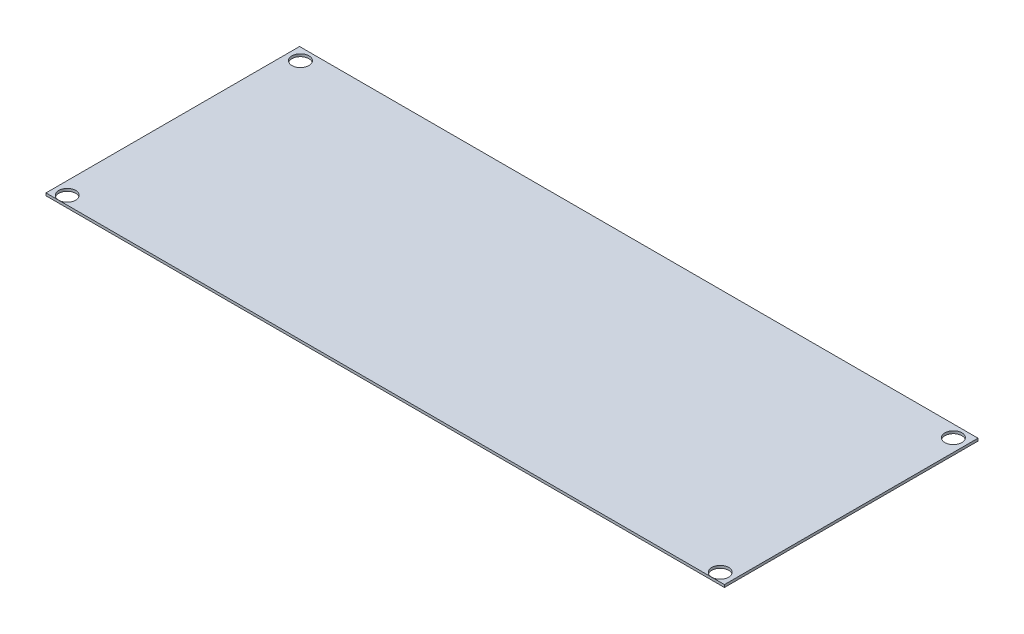
ISO-10303-21;
HEADER;
FILE_DESCRIPTION(('STEP AP214'),'2;1');
FILE_NAME('part.step','',(''),(''),'','','');
FILE_SCHEMA(('AUTOMOTIVE_DESIGN { 1 0 10303 214 1 1 1 1 }'));
ENDSEC;
DATA;
#1=APPLICATION_CONTEXT('core data for automotive mechanical design processes');
#2=APPLICATION_PROTOCOL_DEFINITION('international standard','automotive_design',2000,#1);
#3=PRODUCT_CONTEXT('',#1,'mechanical');
#4=PRODUCT('Part','Part','',(#3));
#5=PRODUCT_RELATED_PRODUCT_CATEGORY('part','',(#4));
#6=PRODUCT_DEFINITION_FORMATION('','',#4);
#7=PRODUCT_DEFINITION_CONTEXT('part definition',#1,'design');
#8=PRODUCT_DEFINITION('design','',#6,#7);
#9=PRODUCT_DEFINITION_SHAPE('','',#8);
#10=(LENGTH_UNIT() NAMED_UNIT(*) SI_UNIT(.MILLI.,.METRE.));
#11=(NAMED_UNIT(*) PLANE_ANGLE_UNIT() SI_UNIT($,.RADIAN.));
#12=(NAMED_UNIT(*) SI_UNIT($,.STERADIAN.) SOLID_ANGLE_UNIT());
#13=UNCERTAINTY_MEASURE_WITH_UNIT(LENGTH_MEASURE(1.E-05),#10,'distance_accuracy_value','');
#14=(GEOMETRIC_REPRESENTATION_CONTEXT(3) GLOBAL_UNCERTAINTY_ASSIGNED_CONTEXT((#13)) GLOBAL_UNIT_ASSIGNED_CONTEXT((#10,
#11,#12)) REPRESENTATION_CONTEXT('',''));
#15=CARTESIAN_POINT('',(0.,0.,0.));
#16=DIRECTION('',(0.,0.,1.));
#17=DIRECTION('',(1.,0.,0.));
#18=AXIS2_PLACEMENT_3D('',#15,#16,#17);
#19=CARTESIAN_POINT('',(4.44089209850063E-13,1.24359290226694E-10,0.));
#20=DIRECTION('',(0.,0.,-1.));
#21=DIRECTION('',(1.,6.22399701222243E-13,0.));
#22=AXIS2_PLACEMENT_3D('',#19,#20,#21);
#23=PLANE('',#22);
#24=DIRECTION('',(-1.,-6.22399701222243E-13,0.));
#25=VECTOR('',#24,1.);
#26=CARTESIAN_POINT('',(-1.4432899320127E-12,3.00000000012436,0.));
#27=LINE('',#26,#25);
#28=CARTESIAN_POINT('',(400.,3.,0.));
#29=VERTEX_POINT('',#28);
#30=CARTESIAN_POINT('',(-400.000000000001,2.9999999998754,0.));
#31=VERTEX_POINT('',#30);
#32=EDGE_CURVE('E83',#29,#31,#27,.T.);
#33=ORIENTED_EDGE('',*,*,#32,.T.);
#34=DIRECTION('',(-6.22399701222243E-13,1.,0.));
#35=VECTOR('',#34,1.);
#36=CARTESIAN_POINT('',(-399.999999999999,-1.24600416789855E-10,0.));
#37=LINE('',#36,#35);
#38=CARTESIAN_POINT('',(-399.999999999999,-1.24600416789855E-10,0.));
#39=VERTEX_POINT('',#38);
#40=EDGE_CURVE('E12',#39,#31,#37,.T.);
#41=ORIENTED_EDGE('',*,*,#40,.F.);
#42=DIRECTION('',(-1.,-6.22399701222243E-13,0.));
#43=VECTOR('',#42,1.);
#44=CARTESIAN_POINT('',(4.44089209850063E-13,1.24359290226694E-10,0.));
#45=LINE('',#44,#43);
#46=CARTESIAN_POINT('',(400.,0.,0.));
#47=VERTEX_POINT('',#46);
#48=EDGE_CURVE('E79',#47,#39,#45,.T.);
#49=ORIENTED_EDGE('',*,*,#48,.F.);
#50=DIRECTION('',(0.,-1.,0.));
#51=VECTOR('',#50,1.);
#52=CARTESIAN_POINT('',(400.,3.,0.));
#53=LINE('',#52,#51);
#54=EDGE_CURVE('E105',#29,#47,#53,.T.);
#55=ORIENTED_EDGE('',*,*,#54,.F.);
#56=EDGE_LOOP('',(#33,#41,#49,#55));
#57=FACE_BOUND('',#56,.T.);
#58=ADVANCED_FACE('F40',(#57),#23,.F.);
#59=CARTESIAN_POINT('',(-399.999999999999,-1.24600416789855E-10,-300.));
#60=DIRECTION('',(1.,6.22399701222243E-13,0.));
#61=DIRECTION('',(0.,0.,1.));
#62=AXIS2_PLACEMENT_3D('',#59,#60,#61);
#63=PLANE('',#62);
#64=DIRECTION('',(0.,0.,-1.));
#65=VECTOR('',#64,1.);
#66=CARTESIAN_POINT('',(-400.000000000001,2.9999999998754,-300.));
#67=LINE('',#66,#65);
#68=CARTESIAN_POINT('',(-400.000000000001,2.9999999998754,-299.));
#69=VERTEX_POINT('',#68);
#70=EDGE_CURVE('E95',#31,#69,#67,.T.);
#71=ORIENTED_EDGE('',*,*,#70,.T.);
#72=DIRECTION('',(-6.22399701222243E-13,1.,0.));
#73=VECTOR('',#72,1.);
#74=CARTESIAN_POINT('',(-399.999999999999,-1.24600416789855E-10,-299.));
#75=LINE('',#74,#73);
#76=CARTESIAN_POINT('',(-399.999999999999,-1.24600416789855E-10,-299.));
#77=VERTEX_POINT('',#76);
#78=EDGE_CURVE('E50',#77,#69,#75,.T.);
#79=ORIENTED_EDGE('',*,*,#78,.F.);
#80=DIRECTION('',(0.,0.,-1.));
#81=VECTOR('',#80,1.);
#82=CARTESIAN_POINT('',(-399.999999999999,-1.24600416789855E-10,-300.));
#83=LINE('',#82,#81);
#84=EDGE_CURVE('E59',#39,#77,#83,.T.);
#85=ORIENTED_EDGE('',*,*,#84,.F.);
#86=ORIENTED_EDGE('',*,*,#40,.T.);
#87=EDGE_LOOP('',(#71,#79,#85,#86));
#88=FACE_BOUND('',#87,.T.);
#89=ADVANCED_FACE('F150',(#88),#63,.F.);
#90=CARTESIAN_POINT('',(4.9960036108132E-13,1.24359290226694E-10,-299.));
#91=DIRECTION('',(0.,0.,1.));
#92=DIRECTION('',(-1.,-6.22399701222243E-13,0.));
#93=AXIS2_PLACEMENT_3D('',#90,#91,#92);
#94=PLANE('',#93);
#95=DIRECTION('',(1.,6.22399701222243E-13,0.));
#96=VECTOR('',#95,1.);
#97=CARTESIAN_POINT('',(-1.38777878078145E-12,3.00000000012436,-299.));
#98=LINE('',#97,#96);
#99=CARTESIAN_POINT('',(400.,3.,-299.));
#100=VERTEX_POINT('',#99);
#101=EDGE_CURVE('E90',#69,#100,#98,.T.);
#102=ORIENTED_EDGE('',*,*,#101,.T.);
#103=DIRECTION('',(0.,-1.,0.));
#104=VECTOR('',#103,1.);
#105=CARTESIAN_POINT('',(400.,3.,-299.));
#106=LINE('',#105,#104);
#107=CARTESIAN_POINT('',(400.,0.,-299.));
#108=VERTEX_POINT('',#107);
#109=EDGE_CURVE('E44',#100,#108,#106,.T.);
#110=ORIENTED_EDGE('',*,*,#109,.T.);
#111=DIRECTION('',(1.,6.22399701222243E-13,0.));
#112=VECTOR('',#111,1.);
#113=CARTESIAN_POINT('',(4.9960036108132E-13,1.24359290226694E-10,-299.));
#114=LINE('',#113,#112);
#115=EDGE_CURVE('E70',#77,#108,#114,.T.);
#116=ORIENTED_EDGE('',*,*,#115,.F.);
#117=ORIENTED_EDGE('',*,*,#78,.T.);
#118=EDGE_LOOP('',(#102,#110,#116,#117));
#119=FACE_BOUND('',#118,.T.);
#120=ADVANCED_FACE('F42',(#119),#94,.F.);
#121=CARTESIAN_POINT('',(4.9960036108132E-13,1.24359290226694E-10,0.));
#122=DIRECTION('',(6.22399701222243E-13,-1.,0.));
#123=DIRECTION('',(0.,0.,1.));
#124=AXIS2_PLACEMENT_3D('',#121,#122,#123);
#125=PLANE('',#124);
#126=CARTESIAN_POINT('',(-384.999999999999,-1.15264568723017E-10,-10.0499999999999));
#127=DIRECTION('',(6.22399701222243E-13,-1.,0.));
#128=DIRECTION('',(0.,0.,1.));
#129=AXIS2_PLACEMENT_3D('',#126,#127,#128);
#130=CIRCLE('',#129,9.99999999999998);
#131=CARTESIAN_POINT('',(-384.999999999999,-1.15265436084755E-10,-0.0499999999999112));
#132=VERTEX_POINT('',#131);
#133=EDGE_CURVE('E109',#132,#132,#130,.T.);
#134=ORIENTED_EDGE('',*,*,#133,.F.);
#135=EDGE_LOOP('',(#134));
#136=FACE_BOUND('',#135,.T.);
#137=CARTESIAN_POINT('',(-384.999999999999,-1.15264568723017E-10,-285.));
#138=DIRECTION('',(6.22399701222243E-13,-1.,0.));
#139=DIRECTION('',(0.,0.,1.));
#140=AXIS2_PLACEMENT_3D('',#137,#138,#139);
#141=CIRCLE('',#140,9.99999999999998);
#142=CARTESIAN_POINT('',(-384.999999999999,-1.15265436084755E-10,-275.));
#143=VERTEX_POINT('',#142);
#144=EDGE_CURVE('E106',#143,#143,#141,.T.);
#145=ORIENTED_EDGE('',*,*,#144,.F.);
#146=EDGE_LOOP('',(#145));
#147=FACE_BOUND('',#146,.T.);
#148=ORIENTED_EDGE('',*,*,#115,.T.);
#149=DIRECTION('',(0.,0.,-1.));
#150=VECTOR('',#149,1.);
#151=CARTESIAN_POINT('',(400.,0.,-300.));
#152=LINE('',#151,#150);
#153=EDGE_CURVE('E102',#47,#108,#152,.T.);
#154=ORIENTED_EDGE('',*,*,#153,.F.);
#155=ORIENTED_EDGE('',*,*,#48,.T.);
#156=ORIENTED_EDGE('',*,*,#84,.T.);
#157=EDGE_LOOP('',(#148,#154,#155,#156));
#158=FACE_BOUND('',#157,.T.);
#159=CARTESIAN_POINT('',(385.,0.,-10.0499999999999));
#160=DIRECTION('',(0.,1.,0.));
#161=DIRECTION('',(0.,0.,1.));
#162=AXIS2_PLACEMENT_3D('',#159,#160,#161);
#163=CIRCLE('',#162,9.99999999999998);
#164=CARTESIAN_POINT('',(385.,0.,-0.0499999999999112));
#165=VERTEX_POINT('',#164);
#166=EDGE_CURVE('E116',#165,#165,#163,.T.);
#167=ORIENTED_EDGE('',*,*,#166,.T.);
#168=EDGE_LOOP('',(#167));
#169=FACE_BOUND('',#168,.T.);
#170=CARTESIAN_POINT('',(385.,0.,-285.));
#171=DIRECTION('',(0.,1.,0.));
#172=DIRECTION('',(0.,0.,1.));
#173=AXIS2_PLACEMENT_3D('',#170,#171,#172);
#174=CIRCLE('',#173,9.99999999999998);
#175=CARTESIAN_POINT('',(385.,0.,-275.));
#176=VERTEX_POINT('',#175);
#177=EDGE_CURVE('E113',#176,#176,#174,.T.);
#178=ORIENTED_EDGE('',*,*,#177,.T.);
#179=EDGE_LOOP('',(#178));
#180=FACE_BOUND('',#179,.T.);
#181=ADVANCED_FACE('F159',(#136,#147,#158,#169,#180),#125,.T.);
#182=CARTESIAN_POINT('',(-1.38777878078145E-12,3.00000000012436,0.));
#183=DIRECTION('',(6.22399701222243E-13,-1.,0.));
#184=DIRECTION('',(0.,0.,1.));
#185=AXIS2_PLACEMENT_3D('',#182,#183,#184);
#186=PLANE('',#185);
#187=CARTESIAN_POINT('',(-385.000000000001,2.99999999988473,-10.0499999999999));
#188=DIRECTION('',(6.22399701222243E-13,-1.,0.));
#189=DIRECTION('',(0.,0.,1.));
#190=AXIS2_PLACEMENT_3D('',#187,#188,#189);
#191=CIRCLE('',#190,9.99999999999998);
#192=CARTESIAN_POINT('',(-385.000000000001,2.99999999988473,-0.0499999999999112));
#193=VERTEX_POINT('',#192);
#194=EDGE_CURVE('E126',#193,#193,#191,.T.);
#195=ORIENTED_EDGE('',*,*,#194,.T.);
#196=EDGE_LOOP('',(#195));
#197=FACE_BOUND('',#196,.T.);
#198=CARTESIAN_POINT('',(-385.000000000001,2.99999999988473,-285.));
#199=DIRECTION('',(6.22399701222243E-13,-1.,0.));
#200=DIRECTION('',(0.,0.,1.));
#201=AXIS2_PLACEMENT_3D('',#198,#199,#200);
#202=CIRCLE('',#201,9.99999999999998);
#203=CARTESIAN_POINT('',(-385.000000000001,2.99999999988473,-275.));
#204=VERTEX_POINT('',#203);
#205=EDGE_CURVE('E121',#204,#204,#202,.T.);
#206=ORIENTED_EDGE('',*,*,#205,.T.);
#207=EDGE_LOOP('',(#206));
#208=FACE_BOUND('',#207,.T.);
#209=ORIENTED_EDGE('',*,*,#32,.F.);
#210=DIRECTION('',(0.,0.,-1.));
#211=VECTOR('',#210,1.);
#212=CARTESIAN_POINT('',(400.,3.,-300.));
#213=LINE('',#212,#211);
#214=EDGE_CURVE('E98',#29,#100,#213,.T.);
#215=ORIENTED_EDGE('',*,*,#214,.T.);
#216=ORIENTED_EDGE('',*,*,#101,.F.);
#217=ORIENTED_EDGE('',*,*,#70,.F.);
#218=EDGE_LOOP('',(#209,#215,#216,#217));
#219=FACE_BOUND('',#218,.T.);
#220=CARTESIAN_POINT('',(385.,3.,-10.0499999999999));
#221=DIRECTION('',(0.,1.,0.));
#222=DIRECTION('',(0.,0.,1.));
#223=AXIS2_PLACEMENT_3D('',#220,#221,#222);
#224=CIRCLE('',#223,9.99999999999998);
#225=CARTESIAN_POINT('',(385.,3.,-0.0499999999999112));
#226=VERTEX_POINT('',#225);
#227=EDGE_CURVE('E117',#226,#226,#224,.T.);
#228=ORIENTED_EDGE('',*,*,#227,.F.);
#229=EDGE_LOOP('',(#228));
#230=FACE_BOUND('',#229,.T.);
#231=CARTESIAN_POINT('',(385.,3.,-285.));
#232=DIRECTION('',(0.,1.,0.));
#233=DIRECTION('',(0.,0.,1.));
#234=AXIS2_PLACEMENT_3D('',#231,#232,#233);
#235=CIRCLE('',#234,9.99999999999998);
#236=CARTESIAN_POINT('',(385.,3.,-275.));
#237=VERTEX_POINT('',#236);
#238=EDGE_CURVE('E184',#237,#237,#235,.T.);
#239=ORIENTED_EDGE('',*,*,#238,.F.);
#240=EDGE_LOOP('',(#239));
#241=FACE_BOUND('',#240,.T.);
#242=ADVANCED_FACE('F99',(#197,#208,#219,#230,#241),#186,.F.);
#243=CARTESIAN_POINT('',(-385.000000000006,9.99999999988473,-285.));
#244=DIRECTION('',(6.22399701222243E-13,-1.,0.));
#245=DIRECTION('',(0.,0.,1.));
#246=AXIS2_PLACEMENT_3D('',#243,#244,#245);
#247=CYLINDRICAL_SURFACE('',#246,9.99999999999998);
#248=CARTESIAN_POINT('',(-384.999999999999,-1.15265436084755E-10,-275.));
#249=CARTESIAN_POINT('',(-384.999999999999,0.0312499998847346,-275.));
#250=CARTESIAN_POINT('',(-385.,0.0624999998847346,-275.));
#251=CARTESIAN_POINT('',(-385.,0.124999999884735,-275.));
#252=CARTESIAN_POINT('',(-385.,0.156249999884735,-275.));
#253=CARTESIAN_POINT('',(-385.,0.218749999884735,-275.));
#254=CARTESIAN_POINT('',(-385.,0.249999999884735,-275.));
#255=CARTESIAN_POINT('',(-385.,0.312499999884735,-275.));
#256=CARTESIAN_POINT('',(-385.,0.343749999884735,-275.));
#257=CARTESIAN_POINT('',(-385.,0.406249999884735,-275.));
#258=CARTESIAN_POINT('',(-385.,0.437499999884735,-275.));
#259=CARTESIAN_POINT('',(-385.,0.499999999884735,-275.));
#260=CARTESIAN_POINT('',(-385.,0.531249999884735,-275.));
#261=CARTESIAN_POINT('',(-385.,0.593749999884735,-275.));
#262=CARTESIAN_POINT('',(-385.,0.624999999884735,-275.));
#263=CARTESIAN_POINT('',(-385.,0.687499999884735,-275.));
#264=CARTESIAN_POINT('',(-385.,0.718749999884735,-275.));
#265=CARTESIAN_POINT('',(-385.,0.781249999884735,-275.));
#266=CARTESIAN_POINT('',(-385.,0.812499999884735,-275.));
#267=CARTESIAN_POINT('',(-385.,0.874999999884735,-275.));
#268=CARTESIAN_POINT('',(-385.,0.906249999884735,-275.));
#269=CARTESIAN_POINT('',(-385.,0.968749999884735,-275.));
#270=CARTESIAN_POINT('',(-385.,0.999999999884735,-275.));
#271=CARTESIAN_POINT('',(-385.,1.06249999988474,-275.));
#272=CARTESIAN_POINT('',(-385.,1.09374999988474,-275.));
#273=CARTESIAN_POINT('',(-385.,1.15624999988474,-275.));
#274=CARTESIAN_POINT('',(-385.,1.18749999988474,-275.));
#275=CARTESIAN_POINT('',(-385.,1.24999999988474,-275.));
#276=CARTESIAN_POINT('',(-385.,1.28124999988474,-275.));
#277=CARTESIAN_POINT('',(-385.,1.34374999988474,-275.));
#278=CARTESIAN_POINT('',(-385.,1.37499999988474,-275.));
#279=CARTESIAN_POINT('',(-385.,1.43749999988474,-275.));
#280=CARTESIAN_POINT('',(-385.,1.46874999988474,-275.));
#281=CARTESIAN_POINT('',(-385.,1.53124999988474,-275.));
#282=CARTESIAN_POINT('',(-385.000000000001,1.56249999988474,-275.));
#283=CARTESIAN_POINT('',(-385.000000000001,1.62499999988474,-275.));
#284=CARTESIAN_POINT('',(-385.000000000001,1.65624999988474,-275.));
#285=CARTESIAN_POINT('',(-385.000000000001,1.71874999988474,-275.));
#286=CARTESIAN_POINT('',(-385.000000000001,1.74999999988474,-275.));
#287=CARTESIAN_POINT('',(-385.000000000001,1.81249999988473,-275.));
#288=CARTESIAN_POINT('',(-385.000000000001,1.84374999988473,-275.));
#289=CARTESIAN_POINT('',(-385.000000000001,1.90624999988473,-275.));
#290=CARTESIAN_POINT('',(-385.000000000001,1.93749999988473,-275.));
#291=CARTESIAN_POINT('',(-385.000000000001,1.99999999988473,-275.));
#292=CARTESIAN_POINT('',(-385.000000000001,2.03124999988473,-275.));
#293=CARTESIAN_POINT('',(-385.000000000001,2.09374999988473,-275.));
#294=CARTESIAN_POINT('',(-385.000000000001,2.12499999988473,-275.));
#295=CARTESIAN_POINT('',(-385.000000000001,2.18749999988473,-275.));
#296=CARTESIAN_POINT('',(-385.000000000001,2.21874999988473,-275.));
#297=CARTESIAN_POINT('',(-385.000000000001,2.28124999988473,-275.));
#298=CARTESIAN_POINT('',(-385.000000000001,2.31249999988473,-275.));
#299=CARTESIAN_POINT('',(-385.000000000001,2.37499999988473,-275.));
#300=CARTESIAN_POINT('',(-385.000000000001,2.40624999988473,-275.));
#301=CARTESIAN_POINT('',(-385.000000000001,2.46874999988473,-275.));
#302=CARTESIAN_POINT('',(-385.000000000001,2.49999999988473,-275.));
#303=CARTESIAN_POINT('',(-385.000000000001,2.56249999988473,-275.));
#304=CARTESIAN_POINT('',(-385.000000000001,2.59374999988473,-275.));
#305=CARTESIAN_POINT('',(-385.000000000001,2.65624999988473,-275.));
#306=CARTESIAN_POINT('',(-385.000000000001,2.68749999988473,-275.));
#307=CARTESIAN_POINT('',(-385.000000000001,2.74999999988473,-275.));
#308=CARTESIAN_POINT('',(-385.000000000001,2.78124999988473,-275.));
#309=CARTESIAN_POINT('',(-385.000000000001,2.84374999988473,-275.));
#310=CARTESIAN_POINT('',(-385.000000000001,2.87499999988473,-275.));
#311=CARTESIAN_POINT('',(-385.000000000001,2.93749999988473,-275.));
#312=CARTESIAN_POINT('',(-385.000000000001,2.96874999988473,-275.));
#313=CARTESIAN_POINT('',(-385.000000000001,2.99999999988473,-275.));
#314=B_SPLINE_CURVE_WITH_KNOTS('',3,(#248,#249,#250,#251,#252,#253,#254,#255,#256,#257,#258,
#259,#260,#261,#262,#263,#264,#265,#266,#267,#268,#269,#270,#271,#272,#273,#274,#275,#276,#277,
#278,#279,#280,#281,#282,#283,#284,#285,#286,#287,#288,#289,#290,#291,#292,#293,#294,#295,#296,
#297,#298,#299,#300,#301,#302,#303,#304,#305,#306,#307,#308,#309,#310,#311,#312,#313),
.UNSPECIFIED.,.F.,.F.,(4,2,2,2,2,2,2,2,2,2,2,2,2,2,2,2,2,2,2,2,2,2,2,2,2,2,2,2,2,2,2,2,4),(0.,
0.0937500000000001,0.1875,0.28125,0.375,0.46875,0.5625,0.656250000000001,0.750000000000001,
0.843750000000001,0.937500000000001,1.03125,1.125,1.21875,1.3125,1.40625,1.5,1.59375,1.6875,
1.78125,1.875,1.96875,2.0625,2.15625,2.25,2.34375,2.4375,2.53125,2.625,2.71875,2.8125,2.90625,
3.),.UNSPECIFIED.);
#315=EDGE_CURVE('BSEAM138',#143,#204,#314,.T.);
#316=ORIENTED_EDGE('',*,*,#144,.T.);
#317=ORIENTED_EDGE('',*,*,#205,.F.);
#318=ORIENTED_EDGE('',*,*,#315,.T.);
#319=ORIENTED_EDGE('',*,*,#315,.F.);
#320=EDGE_LOOP('',(#316,#318,#317,#319));
#321=FACE_BOUND('',#320,.T.);
#322=ADVANCED_FACE('F138',(#321),#247,.F.);
#323=CARTESIAN_POINT('',(-385.000000000006,9.99999999988473,-10.0499999999999));
#324=DIRECTION('',(6.22399701222243E-13,-1.,0.));
#325=DIRECTION('',(0.,0.,1.));
#326=AXIS2_PLACEMENT_3D('',#323,#324,#325);
#327=CYLINDRICAL_SURFACE('',#326,9.99999999999998);
#328=CARTESIAN_POINT('',(-384.999999999999,-1.15265436084755E-10,-0.0499999999999112));
#329=CARTESIAN_POINT('',(-384.999999999999,0.0312499998847346,-0.0499999999999112));
#330=CARTESIAN_POINT('',(-385.,0.0624999998847346,-0.0499999999999112));
#331=CARTESIAN_POINT('',(-385.,0.124999999884735,-0.0499999999999112));
#332=CARTESIAN_POINT('',(-385.,0.156249999884735,-0.0499999999999112));
#333=CARTESIAN_POINT('',(-385.,0.218749999884735,-0.0499999999999112));
#334=CARTESIAN_POINT('',(-385.,0.249999999884735,-0.0499999999999112));
#335=CARTESIAN_POINT('',(-385.,0.312499999884735,-0.0499999999999112));
#336=CARTESIAN_POINT('',(-385.,0.343749999884735,-0.0499999999999112));
#337=CARTESIAN_POINT('',(-385.,0.406249999884735,-0.0499999999999112));
#338=CARTESIAN_POINT('',(-385.,0.437499999884735,-0.0499999999999112));
#339=CARTESIAN_POINT('',(-385.,0.499999999884735,-0.0499999999999112));
#340=CARTESIAN_POINT('',(-385.,0.531249999884735,-0.0499999999999112));
#341=CARTESIAN_POINT('',(-385.,0.593749999884735,-0.0499999999999112));
#342=CARTESIAN_POINT('',(-385.,0.624999999884735,-0.0499999999999112));
#343=CARTESIAN_POINT('',(-385.,0.687499999884735,-0.0499999999999112));
#344=CARTESIAN_POINT('',(-385.,0.718749999884735,-0.0499999999999112));
#345=CARTESIAN_POINT('',(-385.,0.781249999884735,-0.0499999999999112));
#346=CARTESIAN_POINT('',(-385.,0.812499999884735,-0.0499999999999112));
#347=CARTESIAN_POINT('',(-385.,0.874999999884735,-0.0499999999999112));
#348=CARTESIAN_POINT('',(-385.,0.906249999884735,-0.0499999999999112));
#349=CARTESIAN_POINT('',(-385.,0.968749999884735,-0.0499999999999112));
#350=CARTESIAN_POINT('',(-385.,0.999999999884735,-0.0499999999999112));
#351=CARTESIAN_POINT('',(-385.,1.06249999988474,-0.0499999999999112));
#352=CARTESIAN_POINT('',(-385.,1.09374999988474,-0.0499999999999112));
#353=CARTESIAN_POINT('',(-385.,1.15624999988474,-0.0499999999999112));
#354=CARTESIAN_POINT('',(-385.,1.18749999988474,-0.0499999999999112));
#355=CARTESIAN_POINT('',(-385.,1.24999999988474,-0.0499999999999112));
#356=CARTESIAN_POINT('',(-385.,1.28124999988474,-0.0499999999999112));
#357=CARTESIAN_POINT('',(-385.,1.34374999988474,-0.0499999999999112));
#358=CARTESIAN_POINT('',(-385.,1.37499999988474,-0.0499999999999112));
#359=CARTESIAN_POINT('',(-385.,1.43749999988474,-0.0499999999999112));
#360=CARTESIAN_POINT('',(-385.,1.46874999988474,-0.0499999999999112));
#361=CARTESIAN_POINT('',(-385.,1.53124999988474,-0.0499999999999112));
#362=CARTESIAN_POINT('',(-385.000000000001,1.56249999988474,-0.0499999999999112));
#363=CARTESIAN_POINT('',(-385.000000000001,1.62499999988474,-0.0499999999999112));
#364=CARTESIAN_POINT('',(-385.000000000001,1.65624999988474,-0.0499999999999112));
#365=CARTESIAN_POINT('',(-385.000000000001,1.71874999988474,-0.0499999999999112));
#366=CARTESIAN_POINT('',(-385.000000000001,1.74999999988474,-0.0499999999999112));
#367=CARTESIAN_POINT('',(-385.000000000001,1.81249999988473,-0.0499999999999112));
#368=CARTESIAN_POINT('',(-385.000000000001,1.84374999988473,-0.0499999999999112));
#369=CARTESIAN_POINT('',(-385.000000000001,1.90624999988473,-0.0499999999999112));
#370=CARTESIAN_POINT('',(-385.000000000001,1.93749999988473,-0.0499999999999112));
#371=CARTESIAN_POINT('',(-385.000000000001,1.99999999988473,-0.0499999999999112));
#372=CARTESIAN_POINT('',(-385.000000000001,2.03124999988473,-0.0499999999999112));
#373=CARTESIAN_POINT('',(-385.000000000001,2.09374999988473,-0.0499999999999112));
#374=CARTESIAN_POINT('',(-385.000000000001,2.12499999988473,-0.0499999999999112));
#375=CARTESIAN_POINT('',(-385.000000000001,2.18749999988473,-0.0499999999999112));
#376=CARTESIAN_POINT('',(-385.000000000001,2.21874999988473,-0.0499999999999112));
#377=CARTESIAN_POINT('',(-385.000000000001,2.28124999988473,-0.0499999999999112));
#378=CARTESIAN_POINT('',(-385.000000000001,2.31249999988473,-0.0499999999999112));
#379=CARTESIAN_POINT('',(-385.000000000001,2.37499999988473,-0.0499999999999112));
#380=CARTESIAN_POINT('',(-385.000000000001,2.40624999988473,-0.0499999999999112));
#381=CARTESIAN_POINT('',(-385.000000000001,2.46874999988473,-0.0499999999999112));
#382=CARTESIAN_POINT('',(-385.000000000001,2.49999999988473,-0.0499999999999112));
#383=CARTESIAN_POINT('',(-385.000000000001,2.56249999988473,-0.0499999999999112));
#384=CARTESIAN_POINT('',(-385.000000000001,2.59374999988473,-0.0499999999999112));
#385=CARTESIAN_POINT('',(-385.000000000001,2.65624999988473,-0.0499999999999112));
#386=CARTESIAN_POINT('',(-385.000000000001,2.68749999988473,-0.0499999999999112));
#387=CARTESIAN_POINT('',(-385.000000000001,2.74999999988473,-0.0499999999999112));
#388=CARTESIAN_POINT('',(-385.000000000001,2.78124999988473,-0.0499999999999112));
#389=CARTESIAN_POINT('',(-385.000000000001,2.84374999988473,-0.0499999999999112));
#390=CARTESIAN_POINT('',(-385.000000000001,2.87499999988473,-0.0499999999999112));
#391=CARTESIAN_POINT('',(-385.000000000001,2.93749999988473,-0.0499999999999112));
#392=CARTESIAN_POINT('',(-385.000000000001,2.96874999988473,-0.0499999999999112));
#393=CARTESIAN_POINT('',(-385.000000000001,2.99999999988473,-0.0499999999999112));
#394=B_SPLINE_CURVE_WITH_KNOTS('',3,(#328,#329,#330,#331,#332,#333,#334,#335,#336,#337,#338,
#339,#340,#341,#342,#343,#344,#345,#346,#347,#348,#349,#350,#351,#352,#353,#354,#355,#356,#357,
#358,#359,#360,#361,#362,#363,#364,#365,#366,#367,#368,#369,#370,#371,#372,#373,#374,#375,#376,
#377,#378,#379,#380,#381,#382,#383,#384,#385,#386,#387,#388,#389,#390,#391,#392,#393),
.UNSPECIFIED.,.F.,.F.,(4,2,2,2,2,2,2,2,2,2,2,2,2,2,2,2,2,2,2,2,2,2,2,2,2,2,2,2,2,2,2,2,4),(0.,
0.0937500000000001,0.1875,0.28125,0.375,0.46875,0.5625,0.656250000000001,0.750000000000001,
0.843750000000001,0.937500000000001,1.03125,1.125,1.21875,1.3125,1.40625,1.5,1.59375,1.6875,
1.78125,1.875,1.96875,2.0625,2.15625,2.25,2.34375,2.4375,2.53125,2.625,2.71875,2.8125,2.90625,
3.),.UNSPECIFIED.);
#395=EDGE_CURVE('BSEAM136',#132,#193,#394,.T.);
#396=ORIENTED_EDGE('',*,*,#133,.T.);
#397=ORIENTED_EDGE('',*,*,#194,.F.);
#398=ORIENTED_EDGE('',*,*,#395,.T.);
#399=ORIENTED_EDGE('',*,*,#395,.F.);
#400=EDGE_LOOP('',(#396,#398,#397,#399));
#401=FACE_BOUND('',#400,.T.);
#402=ADVANCED_FACE('F136',(#401),#327,.F.);
#403=CARTESIAN_POINT('',(400.,3.,-300.));
#404=DIRECTION('',(-1.,0.,0.));
#405=DIRECTION('',(0.,0.,1.));
#406=AXIS2_PLACEMENT_3D('',#403,#404,#405);
#407=PLANE('',#406);
#408=ORIENTED_EDGE('',*,*,#153,.T.);
#409=ORIENTED_EDGE('',*,*,#109,.F.);
#410=ORIENTED_EDGE('',*,*,#214,.F.);
#411=ORIENTED_EDGE('',*,*,#54,.T.);
#412=EDGE_LOOP('',(#408,#409,#410,#411));
#413=FACE_BOUND('',#412,.T.);
#414=ADVANCED_FACE('F104',(#413),#407,.F.);
#415=CARTESIAN_POINT('',(385.,-7.,-285.));
#416=DIRECTION('',(0.,1.,0.));
#417=DIRECTION('',(0.,0.,1.));
#418=AXIS2_PLACEMENT_3D('',#415,#416,#417);
#419=CYLINDRICAL_SURFACE('',#418,9.99999999999998);
#420=ORIENTED_EDGE('',*,*,#238,.T.);
#421=EDGE_LOOP('',(#420));
#422=FACE_BOUND('',#421,.T.);
#423=ORIENTED_EDGE('',*,*,#177,.F.);
#424=EDGE_LOOP('',(#423));
#425=FACE_BOUND('',#424,.T.);
#426=ADVANCED_FACE('F145',(#422,#425),#419,.F.);
#427=CARTESIAN_POINT('',(385.,-7.,-10.0499999999999));
#428=DIRECTION('',(0.,1.,0.));
#429=DIRECTION('',(0.,0.,1.));
#430=AXIS2_PLACEMENT_3D('',#427,#428,#429);
#431=CYLINDRICAL_SURFACE('',#430,9.99999999999998);
#432=ORIENTED_EDGE('',*,*,#227,.T.);
#433=EDGE_LOOP('',(#432));
#434=FACE_BOUND('',#433,.T.);
#435=ORIENTED_EDGE('',*,*,#166,.F.);
#436=EDGE_LOOP('',(#435));
#437=FACE_BOUND('',#436,.T.);
#438=ADVANCED_FACE('F174',(#434,#437),#431,.F.);
#439=CLOSED_SHELL('',(#58,#89,#120,#181,#242,#322,#402,#414,#426,#438));
#440=MANIFOLD_SOLID_BREP('B2',#439);
#441=ADVANCED_BREP_SHAPE_REPRESENTATION('',(#18,#440),#14);
#442=SHAPE_DEFINITION_REPRESENTATION(#9,#441);
ENDSEC;
END-ISO-10303-21;
